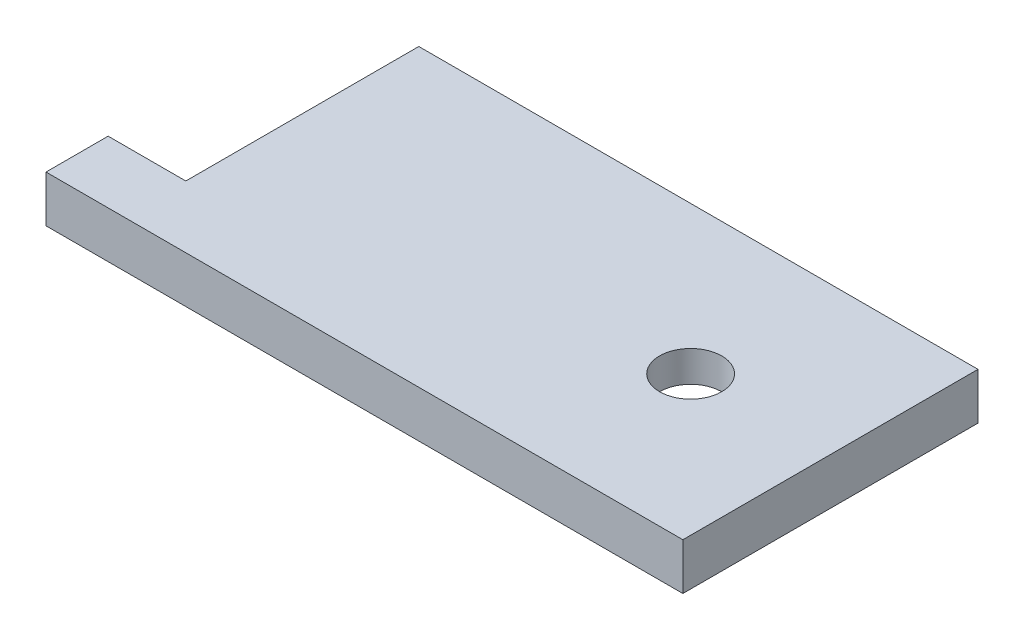
ISO-10303-21;
HEADER;
FILE_DESCRIPTION(('STEP AP214'),'2;1');
FILE_NAME('part.step','',(''),(''),'','','');
FILE_SCHEMA(('AUTOMOTIVE_DESIGN { 1 0 10303 214 1 1 1 1 }'));
ENDSEC;
DATA;
#1=APPLICATION_CONTEXT('core data for automotive mechanical design processes');
#2=APPLICATION_PROTOCOL_DEFINITION('international standard','automotive_design',2000,#1);
#3=PRODUCT_CONTEXT('',#1,'mechanical');
#4=PRODUCT('Part','Part','',(#3));
#5=PRODUCT_RELATED_PRODUCT_CATEGORY('part','',(#4));
#6=PRODUCT_DEFINITION_FORMATION('','',#4);
#7=PRODUCT_DEFINITION_CONTEXT('part definition',#1,'design');
#8=PRODUCT_DEFINITION('design','',#6,#7);
#9=PRODUCT_DEFINITION_SHAPE('','',#8);
#10=(LENGTH_UNIT() NAMED_UNIT(*) SI_UNIT(.MILLI.,.METRE.));
#11=(NAMED_UNIT(*) PLANE_ANGLE_UNIT() SI_UNIT($,.RADIAN.));
#12=(NAMED_UNIT(*) SI_UNIT($,.STERADIAN.) SOLID_ANGLE_UNIT());
#13=UNCERTAINTY_MEASURE_WITH_UNIT(LENGTH_MEASURE(1.E-05),#10,'distance_accuracy_value','');
#14=(GEOMETRIC_REPRESENTATION_CONTEXT(3) GLOBAL_UNCERTAINTY_ASSIGNED_CONTEXT((#13)) GLOBAL_UNIT_ASSIGNED_CONTEXT((#10,
#11,#12)) REPRESENTATION_CONTEXT('',''));
#15=CARTESIAN_POINT('',(0.,0.,0.));
#16=DIRECTION('',(0.,0.,1.));
#17=DIRECTION('',(1.,0.,0.));
#18=AXIS2_PLACEMENT_3D('',#15,#16,#17);
#19=CARTESIAN_POINT('',(0.,0.,19.));
#20=DIRECTION('',(1.,0.,0.));
#21=DIRECTION('',(0.,0.,-1.));
#22=AXIS2_PLACEMENT_3D('',#19,#20,#21);
#23=PLANE('',#22);
#24=DIRECTION('',(0.,-1.,0.));
#25=VECTOR('',#24,1.);
#26=CARTESIAN_POINT('',(0.,0.,15.));
#27=LINE('',#26,#25);
#28=CARTESIAN_POINT('',(0.,3.,15.));
#29=VERTEX_POINT('',#28);
#30=CARTESIAN_POINT('',(0.,0.,15.));
#31=VERTEX_POINT('',#30);
#32=EDGE_CURVE('E55',#29,#31,#27,.T.);
#33=ORIENTED_EDGE('',*,*,#32,.F.);
#34=DIRECTION('',(0.,0.,1.));
#35=VECTOR('',#34,1.);
#36=CARTESIAN_POINT('',(0.,3.,4.));
#37=LINE('',#36,#35);
#38=CARTESIAN_POINT('',(0.,3.,0.));
#39=VERTEX_POINT('',#38);
#40=EDGE_CURVE('E205',#39,#29,#37,.T.);
#41=ORIENTED_EDGE('',*,*,#40,.F.);
#42=DIRECTION('',(0.,-1.,0.));
#43=VECTOR('',#42,1.);
#44=CARTESIAN_POINT('',(0.,3.,0.));
#45=LINE('',#44,#43);
#46=CARTESIAN_POINT('',(0.,0.,0.));
#47=VERTEX_POINT('',#46);
#48=EDGE_CURVE('E159',#39,#47,#45,.T.);
#49=ORIENTED_EDGE('',*,*,#48,.T.);
#50=DIRECTION('',(0.,0.,-1.));
#51=VECTOR('',#50,1.);
#52=CARTESIAN_POINT('',(0.,0.,19.));
#53=LINE('',#52,#51);
#54=EDGE_CURVE('E127',#31,#47,#53,.T.);
#55=ORIENTED_EDGE('',*,*,#54,.F.);
#56=EDGE_LOOP('',(#33,#41,#49,#55));
#57=FACE_BOUND('',#56,.T.);
#58=ADVANCED_FACE('F39',(#57),#23,.F.);
#59=CARTESIAN_POINT('',(36.,0.,19.));
#60=DIRECTION('',(0.,1.,0.));
#61=DIRECTION('',(-1.,0.,0.));
#62=AXIS2_PLACEMENT_3D('',#59,#60,#61);
#63=PLANE('',#62);
#64=DIRECTION('',(1.,0.,0.));
#65=VECTOR('',#64,1.);
#66=CARTESIAN_POINT('',(2.,0.,2.));
#67=LINE('',#66,#65);
#68=CARTESIAN_POINT('',(2.,0.,2.));
#69=VERTEX_POINT('',#68);
#70=CARTESIAN_POINT('',(34.,0.,2.));
#71=VERTEX_POINT('',#70);
#72=EDGE_CURVE('E191',#69,#71,#67,.T.);
#73=ORIENTED_EDGE('',*,*,#72,.F.);
#74=DIRECTION('',(0.,0.,-1.));
#75=VECTOR('',#74,1.);
#76=CARTESIAN_POINT('',(2.,0.,17.));
#77=LINE('',#76,#75);
#78=CARTESIAN_POINT('',(2.,0.,17.));
#79=VERTEX_POINT('',#78);
#80=EDGE_CURVE('E63',#79,#69,#77,.T.);
#81=ORIENTED_EDGE('',*,*,#80,.F.);
#82=DIRECTION('',(-1.,0.,0.));
#83=VECTOR('',#82,1.);
#84=CARTESIAN_POINT('',(2.,0.,17.));
#85=LINE('',#84,#83);
#86=CARTESIAN_POINT('',(34.,0.,17.));
#87=VERTEX_POINT('',#86);
#88=EDGE_CURVE('E176',#87,#79,#85,.T.);
#89=ORIENTED_EDGE('',*,*,#88,.F.);
#90=DIRECTION('',(0.,0.,1.));
#91=VECTOR('',#90,1.);
#92=CARTESIAN_POINT('',(34.,0.,17.));
#93=LINE('',#92,#91);
#94=EDGE_CURVE('E195',#71,#87,#93,.T.);
#95=ORIENTED_EDGE('',*,*,#94,.F.);
#96=EDGE_LOOP('',(#73,#81,#89,#95));
#97=FACE_BOUND('',#96,.T.);
#98=DIRECTION('',(1.,0.,0.));
#99=VECTOR('',#98,1.);
#100=CARTESIAN_POINT('',(36.,0.,19.));
#101=LINE('',#100,#99);
#102=CARTESIAN_POINT('',(-5.,0.,19.));
#103=VERTEX_POINT('',#102);
#104=CARTESIAN_POINT('',(36.,0.,19.));
#105=VERTEX_POINT('',#104);
#106=EDGE_CURVE('E217',#103,#105,#101,.T.);
#107=ORIENTED_EDGE('',*,*,#106,.F.);
#108=DIRECTION('',(0.,0.,1.));
#109=VECTOR('',#108,1.);
#110=CARTESIAN_POINT('',(-5.,0.,19.));
#111=LINE('',#110,#109);
#112=CARTESIAN_POINT('',(-5.,0.,15.));
#113=VERTEX_POINT('',#112);
#114=EDGE_CURVE('E143',#113,#103,#111,.T.);
#115=ORIENTED_EDGE('',*,*,#114,.F.);
#116=DIRECTION('',(1.,0.,0.));
#117=VECTOR('',#116,1.);
#118=CARTESIAN_POINT('',(-5.,0.,15.));
#119=LINE('',#118,#117);
#120=EDGE_CURVE('E152',#113,#31,#119,.T.);
#121=ORIENTED_EDGE('',*,*,#120,.T.);
#122=ORIENTED_EDGE('',*,*,#54,.T.);
#123=DIRECTION('',(1.,0.,0.));
#124=VECTOR('',#123,1.);
#125=CARTESIAN_POINT('',(36.,0.,0.));
#126=LINE('',#125,#124);
#127=CARTESIAN_POINT('',(36.,0.,0.));
#128=VERTEX_POINT('',#127);
#129=EDGE_CURVE('E216',#47,#128,#126,.T.);
#130=ORIENTED_EDGE('',*,*,#129,.T.);
#131=DIRECTION('',(0.,0.,-1.));
#132=VECTOR('',#131,1.);
#133=CARTESIAN_POINT('',(36.,0.,19.));
#134=LINE('',#133,#132);
#135=EDGE_CURVE('E11',#105,#128,#134,.T.);
#136=ORIENTED_EDGE('',*,*,#135,.F.);
#137=EDGE_LOOP('',(#107,#115,#121,#122,#130,#136));
#138=FACE_BOUND('',#137,.T.);
#139=ADVANCED_FACE('F41',(#97,#138),#63,.F.);
#140=CARTESIAN_POINT('',(4.,3.,19.));
#141=DIRECTION('',(0.,-1.,0.));
#142=DIRECTION('',(0.,0.,-1.));
#143=AXIS2_PLACEMENT_3D('',#140,#141,#142);
#144=PLANE('',#143);
#145=CARTESIAN_POINT('',(27.,3.,9.5));
#146=DIRECTION('',(0.,-1.,0.));
#147=DIRECTION('',(0.,0.,-1.));
#148=AXIS2_PLACEMENT_3D('',#145,#146,#147);
#149=CIRCLE('',#148,2.);
#150=CARTESIAN_POINT('',(27.,3.,7.5));
#151=VERTEX_POINT('',#150);
#152=EDGE_CURVE('E167',#151,#151,#149,.T.);
#153=ORIENTED_EDGE('',*,*,#152,.T.);
#154=EDGE_LOOP('',(#153));
#155=FACE_BOUND('',#154,.T.);
#156=DIRECTION('',(-1.,0.,0.));
#157=VECTOR('',#156,1.);
#158=CARTESIAN_POINT('',(4.,3.,0.));
#159=LINE('',#158,#157);
#160=CARTESIAN_POINT('',(36.,3.,0.));
#161=VERTEX_POINT('',#160);
#162=EDGE_CURVE('E220',#161,#39,#159,.T.);
#163=ORIENTED_EDGE('',*,*,#162,.T.);
#164=ORIENTED_EDGE('',*,*,#40,.T.);
#165=DIRECTION('',(1.,0.,0.));
#166=VECTOR('',#165,1.);
#167=CARTESIAN_POINT('',(-5.,3.,15.));
#168=LINE('',#167,#166);
#169=CARTESIAN_POINT('',(-5.,3.,15.));
#170=VERTEX_POINT('',#169);
#171=EDGE_CURVE('E134',#170,#29,#168,.T.);
#172=ORIENTED_EDGE('',*,*,#171,.F.);
#173=DIRECTION('',(0.,0.,-1.));
#174=VECTOR('',#173,1.);
#175=CARTESIAN_POINT('',(-5.,3.,19.));
#176=LINE('',#175,#174);
#177=CARTESIAN_POINT('',(-5.,3.,19.));
#178=VERTEX_POINT('',#177);
#179=EDGE_CURVE('E130',#178,#170,#176,.T.);
#180=ORIENTED_EDGE('',*,*,#179,.F.);
#181=DIRECTION('',(-1.,0.,0.));
#182=VECTOR('',#181,1.);
#183=CARTESIAN_POINT('',(4.,3.,19.));
#184=LINE('',#183,#182);
#185=CARTESIAN_POINT('',(36.,3.,19.));
#186=VERTEX_POINT('',#185);
#187=EDGE_CURVE('E117',#186,#178,#184,.T.);
#188=ORIENTED_EDGE('',*,*,#187,.F.);
#189=DIRECTION('',(0.,0.,-1.));
#190=VECTOR('',#189,1.);
#191=CARTESIAN_POINT('',(36.,3.,19.));
#192=LINE('',#191,#190);
#193=EDGE_CURVE('E48',#186,#161,#192,.T.);
#194=ORIENTED_EDGE('',*,*,#193,.T.);
#195=EDGE_LOOP('',(#163,#164,#172,#180,#188,#194));
#196=FACE_BOUND('',#195,.T.);
#197=ADVANCED_FACE('F132',(#155,#196),#144,.F.);
#198=CARTESIAN_POINT('',(0.,0.,0.));
#199=DIRECTION('',(0.,0.,-1.));
#200=DIRECTION('',(-1.,0.,0.));
#201=AXIS2_PLACEMENT_3D('',#198,#199,#200);
#202=PLANE('',#201);
#203=ORIENTED_EDGE('',*,*,#129,.F.);
#204=ORIENTED_EDGE('',*,*,#48,.F.);
#205=ORIENTED_EDGE('',*,*,#162,.F.);
#206=DIRECTION('',(0.,1.,0.));
#207=VECTOR('',#206,1.);
#208=CARTESIAN_POINT('',(36.,3.,0.));
#209=LINE('',#208,#207);
#210=EDGE_CURVE('E225',#128,#161,#209,.T.);
#211=ORIENTED_EDGE('',*,*,#210,.F.);
#212=EDGE_LOOP('',(#203,#204,#205,#211));
#213=FACE_BOUND('',#212,.T.);
#214=ADVANCED_FACE('F241',(#213),#202,.T.);
#215=CARTESIAN_POINT('',(36.,3.,19.));
#216=DIRECTION('',(-1.,0.,0.));
#217=DIRECTION('',(0.,0.,1.));
#218=AXIS2_PLACEMENT_3D('',#215,#216,#217);
#219=PLANE('',#218);
#220=ORIENTED_EDGE('',*,*,#210,.T.);
#221=ORIENTED_EDGE('',*,*,#193,.F.);
#222=DIRECTION('',(0.,1.,0.));
#223=VECTOR('',#222,1.);
#224=CARTESIAN_POINT('',(36.,3.,19.));
#225=LINE('',#224,#223);
#226=EDGE_CURVE('E123',#105,#186,#225,.T.);
#227=ORIENTED_EDGE('',*,*,#226,.F.);
#228=ORIENTED_EDGE('',*,*,#135,.T.);
#229=EDGE_LOOP('',(#220,#221,#227,#228));
#230=FACE_BOUND('',#229,.T.);
#231=ADVANCED_FACE('F236',(#230),#219,.F.);
#232=CARTESIAN_POINT('',(0.,0.,19.));
#233=DIRECTION('',(0.,0.,-1.));
#234=DIRECTION('',(-1.,0.,0.));
#235=AXIS2_PLACEMENT_3D('',#232,#233,#234);
#236=PLANE('',#235);
#237=ORIENTED_EDGE('',*,*,#187,.T.);
#238=DIRECTION('',(0.,1.,0.));
#239=VECTOR('',#238,1.);
#240=CARTESIAN_POINT('',(-5.,0.,19.));
#241=LINE('',#240,#239);
#242=EDGE_CURVE('E122',#103,#178,#241,.T.);
#243=ORIENTED_EDGE('',*,*,#242,.F.);
#244=ORIENTED_EDGE('',*,*,#106,.T.);
#245=ORIENTED_EDGE('',*,*,#226,.T.);
#246=EDGE_LOOP('',(#237,#243,#244,#245));
#247=FACE_BOUND('',#246,.T.);
#248=ADVANCED_FACE('F119',(#247),#236,.F.);
#249=CARTESIAN_POINT('',(2.,1.,17.));
#250=DIRECTION('',(-1.,0.,0.));
#251=DIRECTION('',(0.,0.,1.));
#252=AXIS2_PLACEMENT_3D('',#249,#250,#251);
#253=PLANE('',#252);
#254=ORIENTED_EDGE('',*,*,#80,.T.);
#255=DIRECTION('',(0.,-1.,0.));
#256=VECTOR('',#255,1.);
#257=CARTESIAN_POINT('',(2.,1.,2.));
#258=LINE('',#257,#256);
#259=CARTESIAN_POINT('',(2.,1.,2.));
#260=VERTEX_POINT('',#259);
#261=EDGE_CURVE('E188',#260,#69,#258,.T.);
#262=ORIENTED_EDGE('',*,*,#261,.F.);
#263=DIRECTION('',(0.,0.,-1.));
#264=VECTOR('',#263,1.);
#265=CARTESIAN_POINT('',(2.,1.,17.));
#266=LINE('',#265,#264);
#267=CARTESIAN_POINT('',(2.,1.,17.));
#268=VERTEX_POINT('',#267);
#269=EDGE_CURVE('E171',#268,#260,#266,.T.);
#270=ORIENTED_EDGE('',*,*,#269,.F.);
#271=DIRECTION('',(0.,-1.,0.));
#272=VECTOR('',#271,1.);
#273=CARTESIAN_POINT('',(2.,1.,17.));
#274=LINE('',#273,#272);
#275=EDGE_CURVE('E202',#268,#79,#274,.T.);
#276=ORIENTED_EDGE('',*,*,#275,.T.);
#277=EDGE_LOOP('',(#254,#262,#270,#276));
#278=FACE_BOUND('',#277,.T.);
#279=ADVANCED_FACE('F263',(#278),#253,.F.);
#280=CARTESIAN_POINT('',(2.,1.,17.));
#281=DIRECTION('',(0.,0.,1.));
#282=DIRECTION('',(1.,0.,0.));
#283=AXIS2_PLACEMENT_3D('',#280,#281,#282);
#284=PLANE('',#283);
#285=ORIENTED_EDGE('',*,*,#88,.T.);
#286=ORIENTED_EDGE('',*,*,#275,.F.);
#287=DIRECTION('',(-1.,0.,0.));
#288=VECTOR('',#287,1.);
#289=CARTESIAN_POINT('',(2.,1.,17.));
#290=LINE('',#289,#288);
#291=CARTESIAN_POINT('',(34.,1.,17.));
#292=VERTEX_POINT('',#291);
#293=EDGE_CURVE('E184',#292,#268,#290,.T.);
#294=ORIENTED_EDGE('',*,*,#293,.F.);
#295=DIRECTION('',(0.,-1.,0.));
#296=VECTOR('',#295,1.);
#297=CARTESIAN_POINT('',(34.,1.,17.));
#298=LINE('',#297,#296);
#299=EDGE_CURVE('E206',#292,#87,#298,.T.);
#300=ORIENTED_EDGE('',*,*,#299,.T.);
#301=EDGE_LOOP('',(#285,#286,#294,#300));
#302=FACE_BOUND('',#301,.T.);
#303=ADVANCED_FACE('F268',(#302),#284,.F.);
#304=CARTESIAN_POINT('',(34.,1.,17.));
#305=DIRECTION('',(1.,0.,0.));
#306=DIRECTION('',(0.,1.,0.));
#307=AXIS2_PLACEMENT_3D('',#304,#305,#306);
#308=PLANE('',#307);
#309=ORIENTED_EDGE('',*,*,#94,.T.);
#310=ORIENTED_EDGE('',*,*,#299,.F.);
#311=DIRECTION('',(0.,0.,1.));
#312=VECTOR('',#311,1.);
#313=CARTESIAN_POINT('',(34.,1.,17.));
#314=LINE('',#313,#312);
#315=CARTESIAN_POINT('',(34.,1.,2.));
#316=VERTEX_POINT('',#315);
#317=EDGE_CURVE('E180',#316,#292,#314,.T.);
#318=ORIENTED_EDGE('',*,*,#317,.F.);
#319=DIRECTION('',(0.,-1.,0.));
#320=VECTOR('',#319,1.);
#321=CARTESIAN_POINT('',(34.,1.,2.));
#322=LINE('',#321,#320);
#323=EDGE_CURVE('E209',#316,#71,#322,.T.);
#324=ORIENTED_EDGE('',*,*,#323,.T.);
#325=EDGE_LOOP('',(#309,#310,#318,#324));
#326=FACE_BOUND('',#325,.T.);
#327=ADVANCED_FACE('F270',(#326),#308,.F.);
#328=CARTESIAN_POINT('',(2.,1.,2.));
#329=DIRECTION('',(0.,0.,-1.));
#330=DIRECTION('',(-1.,0.,0.));
#331=AXIS2_PLACEMENT_3D('',#328,#329,#330);
#332=PLANE('',#331);
#333=ORIENTED_EDGE('',*,*,#72,.T.);
#334=ORIENTED_EDGE('',*,*,#323,.F.);
#335=DIRECTION('',(1.,0.,0.));
#336=VECTOR('',#335,1.);
#337=CARTESIAN_POINT('',(2.,1.,2.));
#338=LINE('',#337,#336);
#339=EDGE_CURVE('E175',#260,#316,#338,.T.);
#340=ORIENTED_EDGE('',*,*,#339,.F.);
#341=ORIENTED_EDGE('',*,*,#261,.T.);
#342=EDGE_LOOP('',(#333,#334,#340,#341));
#343=FACE_BOUND('',#342,.T.);
#344=ADVANCED_FACE('F259',(#343),#332,.F.);
#345=CARTESIAN_POINT('',(0.,1.,0.));
#346=DIRECTION('',(0.,-1.,0.));
#347=DIRECTION('',(1.,0.,0.));
#348=AXIS2_PLACEMENT_3D('',#345,#346,#347);
#349=PLANE('',#348);
#350=CARTESIAN_POINT('',(27.,1.,9.5));
#351=DIRECTION('',(0.,-1.,0.));
#352=DIRECTION('',(1.,0.,0.));
#353=AXIS2_PLACEMENT_3D('',#350,#351,#352);
#354=CIRCLE('',#353,2.);
#355=CARTESIAN_POINT('',(29.,1.,9.5));
#356=VERTEX_POINT('',#355);
#357=EDGE_CURVE('E163',#356,#356,#354,.T.);
#358=ORIENTED_EDGE('',*,*,#357,.F.);
#359=EDGE_LOOP('',(#358));
#360=FACE_BOUND('',#359,.T.);
#361=ORIENTED_EDGE('',*,*,#269,.T.);
#362=ORIENTED_EDGE('',*,*,#339,.T.);
#363=ORIENTED_EDGE('',*,*,#317,.T.);
#364=ORIENTED_EDGE('',*,*,#293,.T.);
#365=EDGE_LOOP('',(#361,#362,#363,#364));
#366=FACE_BOUND('',#365,.T.);
#367=ADVANCED_FACE('F266',(#360,#366),#349,.T.);
#368=CARTESIAN_POINT('',(27.,6.,9.5));
#369=DIRECTION('',(0.,-1.,0.));
#370=DIRECTION('',(1.,0.,0.));
#371=AXIS2_PLACEMENT_3D('',#368,#369,#370);
#372=CYLINDRICAL_SURFACE('',#371,2.);
#373=ORIENTED_EDGE('',*,*,#357,.T.);
#374=EDGE_LOOP('',(#373));
#375=FACE_BOUND('',#374,.T.);
#376=ORIENTED_EDGE('',*,*,#152,.F.);
#377=EDGE_LOOP('',(#376));
#378=FACE_BOUND('',#377,.T.);
#379=ADVANCED_FACE('F324',(#375,#378),#372,.F.);
#380=CARTESIAN_POINT('',(-5.,0.,15.));
#381=DIRECTION('',(0.,0.,1.));
#382=DIRECTION('',(1.,0.,0.));
#383=AXIS2_PLACEMENT_3D('',#380,#381,#382);
#384=PLANE('',#383);
#385=ORIENTED_EDGE('',*,*,#32,.T.);
#386=ORIENTED_EDGE('',*,*,#120,.F.);
#387=DIRECTION('',(0.,-1.,0.));
#388=VECTOR('',#387,1.);
#389=CARTESIAN_POINT('',(-5.,0.,15.));
#390=LINE('',#389,#388);
#391=EDGE_CURVE('E138',#170,#113,#390,.T.);
#392=ORIENTED_EDGE('',*,*,#391,.F.);
#393=ORIENTED_EDGE('',*,*,#171,.T.);
#394=EDGE_LOOP('',(#385,#386,#392,#393));
#395=FACE_BOUND('',#394,.T.);
#396=ADVANCED_FACE('F243',(#395),#384,.F.);
#397=CARTESIAN_POINT('',(-5.,0.,0.));
#398=DIRECTION('',(-1.,0.,0.));
#399=DIRECTION('',(0.,0.,1.));
#400=AXIS2_PLACEMENT_3D('',#397,#398,#399);
#401=PLANE('',#400);
#402=ORIENTED_EDGE('',*,*,#242,.T.);
#403=ORIENTED_EDGE('',*,*,#179,.T.);
#404=ORIENTED_EDGE('',*,*,#391,.T.);
#405=ORIENTED_EDGE('',*,*,#114,.T.);
#406=EDGE_LOOP('',(#402,#403,#404,#405));
#407=FACE_BOUND('',#406,.T.);
#408=ADVANCED_FACE('F141',(#407),#401,.T.);
#409=CLOSED_SHELL('',(#58,#139,#197,#214,#231,#248,#279,#303,#327,#344,#367,#379,#396,#408));
#410=MANIFOLD_SOLID_BREP('B2',#409);
#411=ADVANCED_BREP_SHAPE_REPRESENTATION('',(#18,#410),#14);
#412=SHAPE_DEFINITION_REPRESENTATION(#9,#411);
ENDSEC;
END-ISO-10303-21;
